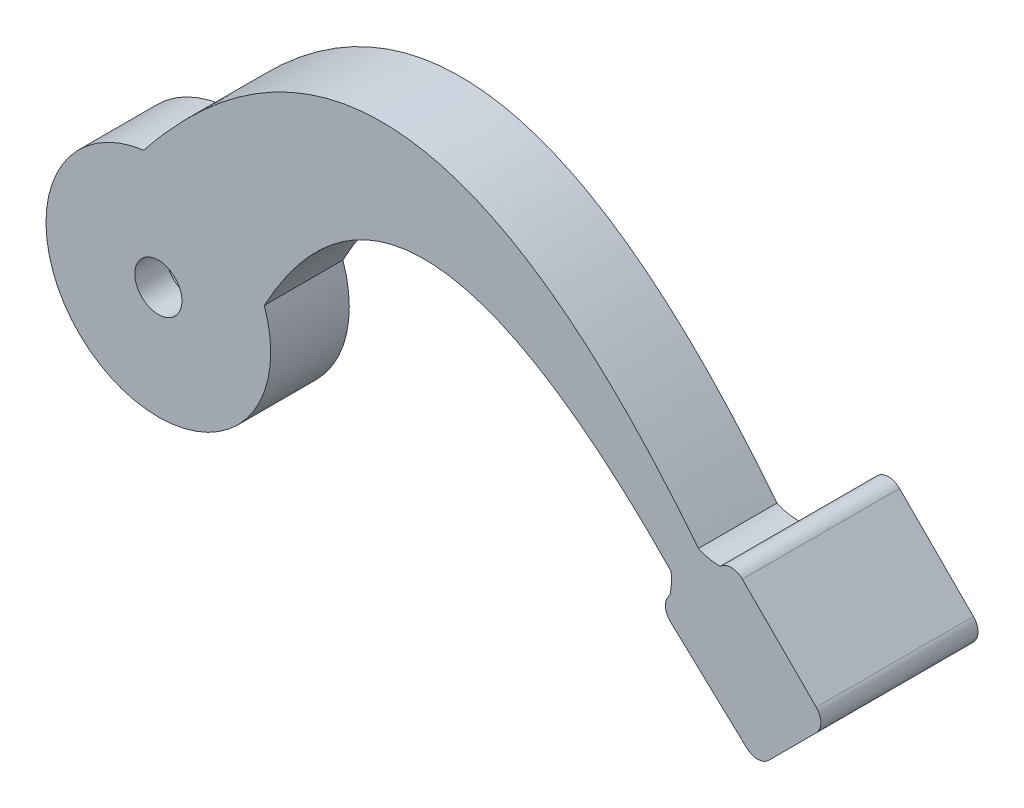
ISO-10303-21;
HEADER;
FILE_DESCRIPTION(('STEP AP214'),'2;1');
FILE_NAME('part.step','',(''),(''),'','','');
FILE_SCHEMA(('AUTOMOTIVE_DESIGN { 1 0 10303 214 1 1 1 1 }'));
ENDSEC;
DATA;
#1=APPLICATION_CONTEXT('core data for automotive mechanical design processes');
#2=APPLICATION_PROTOCOL_DEFINITION('international standard','automotive_design',2000,#1);
#3=PRODUCT_CONTEXT('',#1,'mechanical');
#4=PRODUCT('Part','Part','',(#3));
#5=PRODUCT_RELATED_PRODUCT_CATEGORY('part','',(#4));
#6=PRODUCT_DEFINITION_FORMATION('','',#4);
#7=PRODUCT_DEFINITION_CONTEXT('part definition',#1,'design');
#8=PRODUCT_DEFINITION('design','',#6,#7);
#9=PRODUCT_DEFINITION_SHAPE('','',#8);
#10=(LENGTH_UNIT() NAMED_UNIT(*) SI_UNIT(.MILLI.,.METRE.));
#11=(NAMED_UNIT(*) PLANE_ANGLE_UNIT() SI_UNIT($,.RADIAN.));
#12=(NAMED_UNIT(*) SI_UNIT($,.STERADIAN.) SOLID_ANGLE_UNIT());
#13=UNCERTAINTY_MEASURE_WITH_UNIT(LENGTH_MEASURE(1.E-05),#10,'distance_accuracy_value','');
#14=(GEOMETRIC_REPRESENTATION_CONTEXT(3) GLOBAL_UNCERTAINTY_ASSIGNED_CONTEXT((#13)) GLOBAL_UNIT_ASSIGNED_CONTEXT((#10,
#11,#12)) REPRESENTATION_CONTEXT('',''));
#15=CARTESIAN_POINT('',(0.,0.,0.));
#16=DIRECTION('',(0.,0.,1.));
#17=DIRECTION('',(1.,0.,0.));
#18=AXIS2_PLACEMENT_3D('',#15,#16,#17);
#19=CARTESIAN_POINT('',(0.,0.,5.));
#20=DIRECTION('',(0.,0.,-1.));
#21=DIRECTION('',(-1.,0.,0.));
#22=AXIS2_PLACEMENT_3D('',#19,#20,#21);
#23=CYLINDRICAL_SURFACE('',#22,3.15);
#24=CARTESIAN_POINT('',(0.,0.,0.));
#25=DIRECTION('',(0.,0.,1.));
#26=DIRECTION('',(1.,0.,0.));
#27=AXIS2_PLACEMENT_3D('',#24,#25,#26);
#28=CIRCLE('',#27,3.15);
#29=CARTESIAN_POINT('',(3.15,0.,0.));
#30=VERTEX_POINT('',#29);
#31=EDGE_CURVE('E230',#30,#30,#28,.T.);
#32=ORIENTED_EDGE('',*,*,#31,.F.);
#33=EDGE_LOOP('',(#32));
#34=FACE_BOUND('',#33,.T.);
#35=CARTESIAN_POINT('',(0.,0.,3.));
#36=DIRECTION('',(0.,0.,1.));
#37=DIRECTION('',(1.,0.,0.));
#38=AXIS2_PLACEMENT_3D('',#35,#36,#37);
#39=CIRCLE('',#38,3.15);
#40=CARTESIAN_POINT('',(3.15,0.,3.));
#41=VERTEX_POINT('',#40);
#42=EDGE_CURVE('E182',#41,#41,#39,.T.);
#43=ORIENTED_EDGE('',*,*,#42,.T.);
#44=EDGE_LOOP('',(#43));
#45=FACE_BOUND('',#44,.T.);
#46=ADVANCED_FACE('F39',(#34,#45),#23,.F.);
#47=CARTESIAN_POINT('',(0.,0.,5.));
#48=DIRECTION('',(0.,0.,1.));
#49=DIRECTION('',(1.,0.,0.));
#50=AXIS2_PLACEMENT_3D('',#47,#48,#49);
#51=PLANE('',#50);
#52=CARTESIAN_POINT('',(6.74388026215485,2.37541133484671,5.));
#53=CARTESIAN_POINT('',(15.7783251117649,19.1170818564112,5.));
#54=CARTESIAN_POINT('',(34.0210549557124,-0.824268448298984,5.));
#55=B_SPLINE_CURVE_WITH_KNOTS('',2,(#52,#53,#54),.UNSPECIFIED.,.F.,.F.,(3,3),(0.,1.),.UNSPECIFIED.);
#56=CARTESIAN_POINT('',(6.74388026215485,2.37541133484671,5.));
#57=VERTEX_POINT('',#56);
#58=CARTESIAN_POINT('',(32.6321249510876,0.654655176174024,5.));
#59=VERTEX_POINT('',#58);
#60=EDGE_CURVE('E72',#57,#59,#55,.T.);
#61=ORIENTED_EDGE('',*,*,#60,.T.);
#62=CARTESIAN_POINT('',(31.368103592602,3.24060207044614,5.));
#63=CARTESIAN_POINT('',(33.0113490805245,1.48328105636034,5.));
#64=CARTESIAN_POINT('',(32.5550480902505,-0.697118827142548,5.));
#65=B_SPLINE_CURVE_WITH_KNOTS('',2,(#62,#63,#64),.UNSPECIFIED.,.F.,.F.,(3,3),(0.,1.),.UNSPECIFIED.);
#66=CARTESIAN_POINT('',(32.5550480902505,-0.697118827142546,5.));
#67=VERTEX_POINT('',#66);
#68=EDGE_CURVE('E79',#59,#67,#65,.T.);
#69=ORIENTED_EDGE('',*,*,#68,.T.);
#70=CARTESIAN_POINT('',(33.262154871437,-1.4042256083291,5.));
#71=DIRECTION('',(0.,0.,1.));
#72=DIRECTION('',(1.,0.,0.));
#73=AXIS2_PLACEMENT_3D('',#70,#71,#72);
#74=CIRCLE('',#73,0.999999999999999);
#75=CARTESIAN_POINT('',(32.5805308110778,-2.13592817108212,5.));
#76=VERTEX_POINT('',#75);
#77=EDGE_CURVE('E171',#67,#76,#74,.T.);
#78=ORIENTED_EDGE('',*,*,#77,.T.);
#79=DIRECTION('',(0.731702562753024,-0.681624060359269,0.));
#80=VECTOR('',#79,1.);
#81=CARTESIAN_POINT('',(37.4487491910125,-6.67096050219999,5.));
#82=LINE('',#81,#80);
#83=CARTESIAN_POINT('',(37.4487491910125,-6.6709605022,5.));
#84=VERTEX_POINT('',#83);
#85=EDGE_CURVE('E251',#76,#84,#82,.T.);
#86=ORIENTED_EDGE('',*,*,#85,.T.);
#87=CARTESIAN_POINT('',(38.1303732513718,-5.93925793944698,5.));
#88=DIRECTION('',(0.,0.,1.));
#89=DIRECTION('',(-1.,0.,0.));
#90=AXIS2_PLACEMENT_3D('',#87,#88,#89);
#91=CIRCLE('',#90,0.999999999999995);
#92=CARTESIAN_POINT('',(38.8374800325584,-6.64636472063352,5.));
#93=VERTEX_POINT('',#92);
#94=EDGE_CURVE('E263',#84,#93,#91,.T.);
#95=ORIENTED_EDGE('',*,*,#94,.T.);
#96=DIRECTION('',(0.707106781186548,0.707106781186547,0.));
#97=VECTOR('',#96,1.);
#98=CARTESIAN_POINT('',(41.8637915183506,-3.62005323484132,5.));
#99=LINE('',#98,#97);
#100=CARTESIAN_POINT('',(41.8637915183506,-3.62005323484132,5.));
#101=VERTEX_POINT('',#100);
#102=EDGE_CURVE('E266',#93,#101,#99,.T.);
#103=ORIENTED_EDGE('',*,*,#102,.T.);
#104=CARTESIAN_POINT('',(41.156684737164,-2.91294645365477,5.));
#105=DIRECTION('',(0.,0.,1.));
#106=DIRECTION('',(-1.,0.,0.));
#107=AXIS2_PLACEMENT_3D('',#104,#105,#106);
#108=CIRCLE('',#107,0.999999999999996);
#109=CARTESIAN_POINT('',(41.8637915183506,-2.20583967246823,5.));
#110=VERTEX_POINT('',#109);
#111=EDGE_CURVE('E269',#101,#110,#108,.T.);
#112=ORIENTED_EDGE('',*,*,#111,.T.);
#113=DIRECTION('',(-0.707106781186547,0.707106781186548,0.));
#114=VECTOR('',#113,1.);
#115=CARTESIAN_POINT('',(37.1621661628242,2.4957856830581,5.));
#116=LINE('',#115,#114);
#117=CARTESIAN_POINT('',(37.1621661628242,2.4957856830581,5.));
#118=VERTEX_POINT('',#117);
#119=EDGE_CURVE('E272',#110,#118,#116,.T.);
#120=ORIENTED_EDGE('',*,*,#119,.T.);
#121=CARTESIAN_POINT('',(36.4550593816377,1.78867890187155,5.));
#122=DIRECTION('',(0.,0.,1.));
#123=DIRECTION('',(-1.,0.,0.));
#124=AXIS2_PLACEMENT_3D('',#121,#122,#123);
#125=CIRCLE('',#124,1.);
#126=CARTESIAN_POINT('',(35.7479526004511,2.4957856830581,5.));
#127=VERTEX_POINT('',#126);
#128=EDGE_CURVE('E275',#118,#127,#125,.T.);
#129=ORIENTED_EDGE('',*,*,#128,.T.);
#130=CARTESIAN_POINT('',(35.7479526004511,2.4957856830581,5.));
#131=CARTESIAN_POINT('',(33.9748506145299,2.52505140535702,5.));
#132=CARTESIAN_POINT('',(32.9213950101655,4.01724777922791,5.));
#133=B_SPLINE_CURVE_WITH_KNOTS('',2,(#130,#131,#132),.UNSPECIFIED.,.F.,.F.,(3,3),(0.,1.),.UNSPECIFIED.);
#134=CARTESIAN_POINT('',(34.3623263576712,2.78867889547021,5.));
#135=VERTEX_POINT('',#134);
#136=EDGE_CURVE('E249',#127,#135,#133,.T.);
#137=ORIENTED_EDGE('',*,*,#136,.T.);
#138=CARTESIAN_POINT('',(35.9052240240487,0.760247248579325,5.));
#139=CARTESIAN_POINT('',(15.7376384267378,28.1143705487312,5.));
#140=CARTESIAN_POINT('',(-0.926838299045893,7.08967353038359,5.));
#141=B_SPLINE_CURVE_WITH_KNOTS('',2,(#138,#139,#140),.UNSPECIFIED.,.F.,.F.,(3,3),(0.,1.),.UNSPECIFIED.);
#142=CARTESIAN_POINT('',(-0.926838299045891,7.08967353038359,5.));
#143=VERTEX_POINT('',#142);
#144=EDGE_CURVE('E54',#135,#143,#141,.T.);
#145=ORIENTED_EDGE('',*,*,#144,.T.);
#146=CARTESIAN_POINT('',(0.,0.,5.));
#147=DIRECTION('',(0.,0.,1.));
#148=DIRECTION('',(1.,0.,0.));
#149=AXIS2_PLACEMENT_3D('',#146,#147,#148);
#150=CIRCLE('',#149,7.15);
#151=EDGE_CURVE('E225',#143,#57,#150,.T.);
#152=ORIENTED_EDGE('',*,*,#151,.T.);
#153=EDGE_LOOP('',(#61,#69,#78,#86,#95,#103,#112,#120,#129,#137,#145,#152));
#154=FACE_BOUND('',#153,.T.);
#155=CARTESIAN_POINT('',(0.,0.,5.));
#156=DIRECTION('',(0.,0.,1.));
#157=DIRECTION('',(1.,0.,0.));
#158=AXIS2_PLACEMENT_3D('',#155,#156,#157);
#159=CIRCLE('',#158,1.5);
#160=CARTESIAN_POINT('',(1.5,0.,5.));
#161=VERTEX_POINT('',#160);
#162=EDGE_CURVE('E183',#161,#161,#159,.T.);
#163=ORIENTED_EDGE('',*,*,#162,.F.);
#164=EDGE_LOOP('',(#163));
#165=FACE_BOUND('',#164,.T.);
#166=ADVANCED_FACE('F212',(#154,#165),#51,.T.);
#167=CARTESIAN_POINT('',(0.,0.,0.));
#168=DIRECTION('',(0.,0.,1.));
#169=DIRECTION('',(1.,0.,0.));
#170=AXIS2_PLACEMENT_3D('',#167,#168,#169);
#171=PLANE('',#170);
#172=CARTESIAN_POINT('',(0.,0.,0.));
#173=DIRECTION('',(0.,0.,1.));
#174=DIRECTION('',(1.,0.,0.));
#175=AXIS2_PLACEMENT_3D('',#172,#173,#174);
#176=CIRCLE('',#175,7.15);
#177=CARTESIAN_POINT('',(-0.926838299045893,7.08967353038359,0.));
#178=VERTEX_POINT('',#177);
#179=CARTESIAN_POINT('',(6.74388026215485,2.37541133484671,0.));
#180=VERTEX_POINT('',#179);
#181=EDGE_CURVE('E228',#178,#180,#176,.T.);
#182=ORIENTED_EDGE('',*,*,#181,.F.);
#183=CARTESIAN_POINT('',(35.9052240240487,0.760247248579325,0.));
#184=CARTESIAN_POINT('',(15.7376384267378,28.1143705487312,0.));
#185=CARTESIAN_POINT('',(-0.926838299045893,7.08967353038359,0.));
#186=B_SPLINE_CURVE_WITH_KNOTS('',2,(#183,#184,#185),.UNSPECIFIED.,.F.,.F.,(3,3),(0.,1.),.UNSPECIFIED.);
#187=CARTESIAN_POINT('',(34.362326343591,2.78867890176701,0.));
#188=VERTEX_POINT('',#187);
#189=EDGE_CURVE('E189',#188,#178,#186,.T.);
#190=ORIENTED_EDGE('',*,*,#189,.F.);
#191=CARTESIAN_POINT('',(35.7479526004511,2.4957856830581,0.));
#192=CARTESIAN_POINT('',(33.9748506145299,2.52505140535702,0.));
#193=CARTESIAN_POINT('',(32.9213950101655,4.01724777922791,0.));
#194=B_SPLINE_CURVE_WITH_KNOTS('',2,(#191,#192,#193),.UNSPECIFIED.,.F.,.F.,(3,3),(0.,1.),.UNSPECIFIED.);
#195=CARTESIAN_POINT('',(35.7479526004511,2.4957856830581,0.));
#196=VERTEX_POINT('',#195);
#197=EDGE_CURVE('E164',#188,#196,#194,.F.);
#198=ORIENTED_EDGE('',*,*,#197,.T.);
#199=DIRECTION('',(-0.707106781186547,-0.707106781186548,0.));
#200=VECTOR('',#199,1.);
#201=CARTESIAN_POINT('',(35.7479526004511,2.4957856830581,0.));
#202=LINE('',#201,#200);
#203=CARTESIAN_POINT('',(32.5550480902505,-0.697118827142546,0.));
#204=VERTEX_POINT('',#203);
#205=EDGE_CURVE('E145',#196,#204,#202,.T.);
#206=ORIENTED_EDGE('',*,*,#205,.T.);
#207=CARTESIAN_POINT('',(31.368103592602,3.24060207044614,0.));
#208=CARTESIAN_POINT('',(33.0113490805245,1.48328105636034,0.));
#209=CARTESIAN_POINT('',(32.5550480902505,-0.697118827142548,0.));
#210=B_SPLINE_CURVE_WITH_KNOTS('',2,(#207,#208,#209),.UNSPECIFIED.,.F.,.F.,(3,3),(0.,1.),.UNSPECIFIED.);
#211=CARTESIAN_POINT('',(32.6321249510929,0.654655176123201,0.));
#212=VERTEX_POINT('',#211);
#213=EDGE_CURVE('E162',#204,#212,#210,.F.);
#214=ORIENTED_EDGE('',*,*,#213,.T.);
#215=CARTESIAN_POINT('',(6.74388026215485,2.37541133484671,0.));
#216=CARTESIAN_POINT('',(15.7783251117649,19.1170818564112,0.));
#217=CARTESIAN_POINT('',(34.0210549557124,-0.824268448298984,0.));
#218=B_SPLINE_CURVE_WITH_KNOTS('',2,(#215,#216,#217),.UNSPECIFIED.,.F.,.F.,(3,3),(0.,1.),.UNSPECIFIED.);
#219=EDGE_CURVE('E194',#180,#212,#218,.T.);
#220=ORIENTED_EDGE('',*,*,#219,.F.);
#221=EDGE_LOOP('',(#182,#190,#198,#206,#214,#220));
#222=FACE_BOUND('',#221,.T.);
#223=ORIENTED_EDGE('',*,*,#31,.T.);
#224=EDGE_LOOP('',(#223));
#225=FACE_BOUND('',#224,.T.);
#226=ADVANCED_FACE('F160',(#222,#225),#171,.F.);
#227=CARTESIAN_POINT('',(0.,0.,5.));
#228=DIRECTION('',(0.,0.,-1.));
#229=DIRECTION('',(-1.,0.,0.));
#230=AXIS2_PLACEMENT_3D('',#227,#228,#229);
#231=CYLINDRICAL_SURFACE('',#230,7.15);
#232=ORIENTED_EDGE('',*,*,#151,.F.);
#233=DIRECTION('',(0.,0.,1.));
#234=VECTOR('',#233,1.);
#235=CARTESIAN_POINT('',(-0.926838299045893,7.08967353038359,0.));
#236=LINE('',#235,#234);
#237=EDGE_CURVE('E227',#178,#143,#236,.T.);
#238=ORIENTED_EDGE('',*,*,#237,.F.);
#239=ORIENTED_EDGE('',*,*,#181,.T.);
#240=DIRECTION('',(0.,0.,1.));
#241=VECTOR('',#240,1.);
#242=CARTESIAN_POINT('',(6.74388026215485,2.37541133484671,0.));
#243=LINE('',#242,#241);
#244=EDGE_CURVE('E63',#180,#57,#243,.T.);
#245=ORIENTED_EDGE('',*,*,#244,.T.);
#246=EDGE_LOOP('',(#232,#238,#239,#245));
#247=FACE_BOUND('',#246,.T.);
#248=ADVANCED_FACE('F41',(#247),#231,.T.);
#249=DIRECTION('',(0.,0.,1.));
#250=VECTOR('',#249,1.);
#251=SURFACE_OF_LINEAR_EXTRUSION('',#186,#250);
#252=DIRECTION('',(0.,0.,1.));
#253=VECTOR('',#252,1.);
#254=CARTESIAN_POINT('',(34.362326343591,2.78867890176701,-5.));
#255=LINE('',#254,#253);
#256=EDGE_CURVE('E11',#188,#135,#255,.T.);
#257=ORIENTED_EDGE('',*,*,#256,.F.);
#258=ORIENTED_EDGE('',*,*,#189,.T.);
#259=ORIENTED_EDGE('',*,*,#237,.T.);
#260=ORIENTED_EDGE('',*,*,#144,.F.);
#261=EDGE_LOOP('',(#257,#258,#259,#260));
#262=FACE_BOUND('',#261,.T.);
#263=ADVANCED_FACE('F203',(#262),#251,.T.);
#264=DIRECTION('',(0.,0.,1.));
#265=VECTOR('',#264,1.);
#266=SURFACE_OF_LINEAR_EXTRUSION('',#218,#265);
#267=DIRECTION('',(0.,0.,1.));
#268=VECTOR('',#267,1.);
#269=CARTESIAN_POINT('',(32.6321249510929,0.65465517612328,-5.));
#270=LINE('',#269,#268);
#271=EDGE_CURVE('E47',#59,#212,#270,.F.);
#272=ORIENTED_EDGE('',*,*,#271,.F.);
#273=ORIENTED_EDGE('',*,*,#60,.F.);
#274=ORIENTED_EDGE('',*,*,#244,.F.);
#275=ORIENTED_EDGE('',*,*,#219,.T.);
#276=EDGE_LOOP('',(#272,#273,#274,#275));
#277=FACE_BOUND('',#276,.T.);
#278=ADVANCED_FACE('F207',(#277),#266,.T.);
#279=CARTESIAN_POINT('',(0.,0.,3.));
#280=DIRECTION('',(0.,0.,1.));
#281=DIRECTION('',(1.,0.,0.));
#282=AXIS2_PLACEMENT_3D('',#279,#280,#281);
#283=PLANE('',#282);
#284=CARTESIAN_POINT('',(0.,0.,3.));
#285=DIRECTION('',(0.,0.,1.));
#286=DIRECTION('',(1.,0.,0.));
#287=AXIS2_PLACEMENT_3D('',#284,#285,#286);
#288=CIRCLE('',#287,1.5);
#289=CARTESIAN_POINT('',(1.5,0.,3.));
#290=VERTEX_POINT('',#289);
#291=EDGE_CURVE('E179',#290,#290,#288,.T.);
#292=ORIENTED_EDGE('',*,*,#291,.T.);
#293=EDGE_LOOP('',(#292));
#294=FACE_BOUND('',#293,.T.);
#295=ORIENTED_EDGE('',*,*,#42,.F.);
#296=EDGE_LOOP('',(#295));
#297=FACE_BOUND('',#296,.T.);
#298=ADVANCED_FACE('F323',(#294,#297),#283,.F.);
#299=CARTESIAN_POINT('',(0.,0.,3.));
#300=DIRECTION('',(0.,0.,1.));
#301=DIRECTION('',(1.,0.,0.));
#302=AXIS2_PLACEMENT_3D('',#299,#300,#301);
#303=CYLINDRICAL_SURFACE('',#302,1.5);
#304=ORIENTED_EDGE('',*,*,#291,.F.);
#305=EDGE_LOOP('',(#304));
#306=FACE_BOUND('',#305,.T.);
#307=ORIENTED_EDGE('',*,*,#162,.T.);
#308=EDGE_LOOP('',(#307));
#309=FACE_BOUND('',#308,.T.);
#310=ADVANCED_FACE('F328',(#306,#309),#303,.F.);
#311=CARTESIAN_POINT('',(35.7479526004511,2.4957856830581,-5.));
#312=CARTESIAN_POINT('',(33.9748506145299,2.52505140535702,-5.));
#313=CARTESIAN_POINT('',(32.9213950101655,4.01724777922791,-5.));
#314=B_SPLINE_CURVE_WITH_KNOTS('',2,(#311,#312,#313),.UNSPECIFIED.,.F.,.F.,(3,3),(0.,1.),.UNSPECIFIED.);
#315=DIRECTION('',(0.,0.,1.));
#316=VECTOR('',#315,1.);
#317=SURFACE_OF_LINEAR_EXTRUSION('',#314,#316);
#318=ORIENTED_EDGE('',*,*,#197,.F.);
#319=ORIENTED_EDGE('',*,*,#256,.T.);
#320=ORIENTED_EDGE('',*,*,#136,.F.);
#321=DIRECTION('',(0.,0.,1.));
#322=VECTOR('',#321,1.);
#323=CARTESIAN_POINT('',(35.7479526004511,2.4957856830581,-5.));
#324=LINE('',#323,#322);
#325=EDGE_CURVE('E281',#196,#127,#324,.T.);
#326=ORIENTED_EDGE('',*,*,#325,.F.);
#327=EDGE_LOOP('',(#318,#319,#320,#326));
#328=FACE_BOUND('',#327,.T.);
#329=ADVANCED_FACE('F320',(#328),#317,.T.);
#330=CARTESIAN_POINT('',(31.368103592602,3.24060207044614,-5.));
#331=CARTESIAN_POINT('',(33.0113490805245,1.48328105636034,-5.));
#332=CARTESIAN_POINT('',(32.5550480902505,-0.697118827142548,-5.));
#333=B_SPLINE_CURVE_WITH_KNOTS('',2,(#330,#331,#332),.UNSPECIFIED.,.F.,.F.,(3,3),(0.,1.),.UNSPECIFIED.);
#334=DIRECTION('',(0.,0.,1.));
#335=VECTOR('',#334,1.);
#336=SURFACE_OF_LINEAR_EXTRUSION('',#333,#335);
#337=ORIENTED_EDGE('',*,*,#213,.F.);
#338=DIRECTION('',(0.,0.,1.));
#339=VECTOR('',#338,1.);
#340=CARTESIAN_POINT('',(32.5550480902505,-0.697118827142546,-5.));
#341=LINE('',#340,#339);
#342=EDGE_CURVE('E154',#204,#67,#341,.T.);
#343=ORIENTED_EDGE('',*,*,#342,.T.);
#344=ORIENTED_EDGE('',*,*,#68,.F.);
#345=ORIENTED_EDGE('',*,*,#271,.T.);
#346=EDGE_LOOP('',(#337,#343,#344,#345));
#347=FACE_BOUND('',#346,.T.);
#348=ADVANCED_FACE('F166',(#347),#336,.T.);
#349=CARTESIAN_POINT('',(36.4550593816377,1.78867890187155,-5.));
#350=DIRECTION('',(0.,0.,1.));
#351=DIRECTION('',(1.,0.,0.));
#352=AXIS2_PLACEMENT_3D('',#349,#350,#351);
#353=CYLINDRICAL_SURFACE('',#352,1.);
#354=ORIENTED_EDGE('',*,*,#128,.F.);
#355=DIRECTION('',(0.,0.,1.));
#356=VECTOR('',#355,1.);
#357=CARTESIAN_POINT('',(37.1621661628242,2.4957856830581,-5.));
#358=LINE('',#357,#356);
#359=CARTESIAN_POINT('',(37.1621661628242,2.4957856830581,-5.));
#360=VERTEX_POINT('',#359);
#361=EDGE_CURVE('E282',#360,#118,#358,.T.);
#362=ORIENTED_EDGE('',*,*,#361,.F.);
#363=CARTESIAN_POINT('',(36.4550593816377,1.78867890187155,-5.));
#364=DIRECTION('',(0.,0.,1.));
#365=DIRECTION('',(-1.,0.,0.));
#366=AXIS2_PLACEMENT_3D('',#363,#364,#365);
#367=CIRCLE('',#366,1.);
#368=CARTESIAN_POINT('',(35.7479526004511,2.4957856830581,-5.));
#369=VERTEX_POINT('',#368);
#370=EDGE_CURVE('E172',#360,#369,#367,.T.);
#371=ORIENTED_EDGE('',*,*,#370,.T.);
#372=EDGE_CURVE('E186',#369,#196,#324,.T.);
#373=ORIENTED_EDGE('',*,*,#372,.T.);
#374=ORIENTED_EDGE('',*,*,#325,.T.);
#375=EDGE_LOOP('',(#354,#362,#371,#373,#374));
#376=FACE_BOUND('',#375,.T.);
#377=ADVANCED_FACE('F316',(#376),#353,.T.);
#378=CARTESIAN_POINT('',(37.1621661628242,2.4957856830581,-5.));
#379=DIRECTION('',(0.707106781186548,0.707106781186547,0.));
#380=DIRECTION('',(-0.707106781186547,0.707106781186548,0.));
#381=AXIS2_PLACEMENT_3D('',#378,#379,#380);
#382=PLANE('',#381);
#383=ORIENTED_EDGE('',*,*,#119,.F.);
#384=DIRECTION('',(0.,0.,1.));
#385=VECTOR('',#384,1.);
#386=CARTESIAN_POINT('',(41.8637915183506,-2.20583967246823,-5.));
#387=LINE('',#386,#385);
#388=CARTESIAN_POINT('',(41.8637915183506,-2.20583967246823,-5.));
#389=VERTEX_POINT('',#388);
#390=EDGE_CURVE('E284',#389,#110,#387,.T.);
#391=ORIENTED_EDGE('',*,*,#390,.F.);
#392=DIRECTION('',(-0.707106781186547,0.707106781186548,0.));
#393=VECTOR('',#392,1.);
#394=CARTESIAN_POINT('',(37.1621661628242,2.4957856830581,-5.));
#395=LINE('',#394,#393);
#396=EDGE_CURVE('E174',#389,#360,#395,.T.);
#397=ORIENTED_EDGE('',*,*,#396,.T.);
#398=ORIENTED_EDGE('',*,*,#361,.T.);
#399=EDGE_LOOP('',(#383,#391,#397,#398));
#400=FACE_BOUND('',#399,.T.);
#401=ADVANCED_FACE('F366',(#400),#382,.T.);
#402=CARTESIAN_POINT('',(41.156684737164,-2.91294645365477,-5.));
#403=DIRECTION('',(0.,0.,1.));
#404=DIRECTION('',(1.,0.,0.));
#405=AXIS2_PLACEMENT_3D('',#402,#403,#404);
#406=CYLINDRICAL_SURFACE('',#405,0.999999999999996);
#407=ORIENTED_EDGE('',*,*,#111,.F.);
#408=DIRECTION('',(0.,0.,1.));
#409=VECTOR('',#408,1.);
#410=CARTESIAN_POINT('',(41.8637915183506,-3.62005323484132,-5.));
#411=LINE('',#410,#409);
#412=CARTESIAN_POINT('',(41.8637915183506,-3.62005323484132,-5.));
#413=VERTEX_POINT('',#412);
#414=EDGE_CURVE('E286',#413,#101,#411,.T.);
#415=ORIENTED_EDGE('',*,*,#414,.F.);
#416=CARTESIAN_POINT('',(41.156684737164,-2.91294645365477,-5.));
#417=DIRECTION('',(0.,0.,1.));
#418=DIRECTION('',(-1.,0.,0.));
#419=AXIS2_PLACEMENT_3D('',#416,#417,#418);
#420=CIRCLE('',#419,0.999999999999996);
#421=EDGE_CURVE('E362',#413,#389,#420,.T.);
#422=ORIENTED_EDGE('',*,*,#421,.T.);
#423=ORIENTED_EDGE('',*,*,#390,.T.);
#424=EDGE_LOOP('',(#407,#415,#422,#423));
#425=FACE_BOUND('',#424,.T.);
#426=ADVANCED_FACE('F311',(#425),#406,.T.);
#427=CARTESIAN_POINT('',(41.8637915183506,-3.62005323484132,-5.));
#428=DIRECTION('',(0.707106781186547,-0.707106781186548,0.));
#429=DIRECTION('',(0.707106781186548,0.707106781186547,0.));
#430=AXIS2_PLACEMENT_3D('',#427,#428,#429);
#431=PLANE('',#430);
#432=ORIENTED_EDGE('',*,*,#102,.F.);
#433=DIRECTION('',(0.,0.,1.));
#434=VECTOR('',#433,1.);
#435=CARTESIAN_POINT('',(38.8374800325584,-6.64636472063352,-5.));
#436=LINE('',#435,#434);
#437=CARTESIAN_POINT('',(38.8374800325584,-6.64636472063352,-5.));
#438=VERTEX_POINT('',#437);
#439=EDGE_CURVE('E288',#438,#93,#436,.T.);
#440=ORIENTED_EDGE('',*,*,#439,.F.);
#441=DIRECTION('',(0.707106781186548,0.707106781186547,0.));
#442=VECTOR('',#441,1.);
#443=CARTESIAN_POINT('',(41.8637915183506,-3.62005323484132,-5.));
#444=LINE('',#443,#442);
#445=EDGE_CURVE('E307',#438,#413,#444,.T.);
#446=ORIENTED_EDGE('',*,*,#445,.T.);
#447=ORIENTED_EDGE('',*,*,#414,.T.);
#448=EDGE_LOOP('',(#432,#440,#446,#447));
#449=FACE_BOUND('',#448,.T.);
#450=ADVANCED_FACE('F305',(#449),#431,.T.);
#451=CARTESIAN_POINT('',(38.1303732513718,-5.93925793944698,-5.));
#452=DIRECTION('',(0.,0.,1.));
#453=DIRECTION('',(1.,0.,0.));
#454=AXIS2_PLACEMENT_3D('',#451,#452,#453);
#455=CYLINDRICAL_SURFACE('',#454,0.999999999999995);
#456=ORIENTED_EDGE('',*,*,#94,.F.);
#457=DIRECTION('',(0.,0.,1.));
#458=VECTOR('',#457,1.);
#459=CARTESIAN_POINT('',(37.4487491910125,-6.6709605022,-5.));
#460=LINE('',#459,#458);
#461=CARTESIAN_POINT('',(37.4487491910125,-6.6709605022,-5.));
#462=VERTEX_POINT('',#461);
#463=EDGE_CURVE('E289',#462,#84,#460,.T.);
#464=ORIENTED_EDGE('',*,*,#463,.F.);
#465=CARTESIAN_POINT('',(38.1303732513718,-5.93925793944698,-5.));
#466=DIRECTION('',(0.,0.,1.));
#467=DIRECTION('',(-1.,0.,0.));
#468=AXIS2_PLACEMENT_3D('',#465,#466,#467);
#469=CIRCLE('',#468,0.999999999999995);
#470=EDGE_CURVE('E301',#462,#438,#469,.T.);
#471=ORIENTED_EDGE('',*,*,#470,.T.);
#472=ORIENTED_EDGE('',*,*,#439,.T.);
#473=EDGE_LOOP('',(#456,#464,#471,#472));
#474=FACE_BOUND('',#473,.T.);
#475=ADVANCED_FACE('F298',(#474),#455,.T.);
#476=CARTESIAN_POINT('',(37.4487491910125,-6.67096050219999,-5.));
#477=DIRECTION('',(-0.681624060359269,-0.731702562753024,0.));
#478=DIRECTION('',(0.731702562753024,-0.681624060359269,0.));
#479=AXIS2_PLACEMENT_3D('',#476,#477,#478);
#480=PLANE('',#479);
#481=ORIENTED_EDGE('',*,*,#85,.F.);
#482=DIRECTION('',(0.,0.,1.));
#483=VECTOR('',#482,1.);
#484=CARTESIAN_POINT('',(32.5805308110778,-2.13592817108212,-5.));
#485=LINE('',#484,#483);
#486=CARTESIAN_POINT('',(32.5805308110778,-2.13592817108212,-5.));
#487=VERTEX_POINT('',#486);
#488=EDGE_CURVE('E153',#487,#76,#485,.T.);
#489=ORIENTED_EDGE('',*,*,#488,.F.);
#490=DIRECTION('',(0.731702562753024,-0.681624060359269,0.));
#491=VECTOR('',#490,1.);
#492=CARTESIAN_POINT('',(37.4487491910125,-6.67096050219999,-5.));
#493=LINE('',#492,#491);
#494=EDGE_CURVE('E358',#487,#462,#493,.T.);
#495=ORIENTED_EDGE('',*,*,#494,.T.);
#496=ORIENTED_EDGE('',*,*,#463,.T.);
#497=EDGE_LOOP('',(#481,#489,#495,#496));
#498=FACE_BOUND('',#497,.T.);
#499=ADVANCED_FACE('F295',(#498),#480,.T.);
#500=CARTESIAN_POINT('',(33.262154871437,-1.4042256083291,-5.));
#501=DIRECTION('',(0.,0.,1.));
#502=DIRECTION('',(1.,0.,0.));
#503=AXIS2_PLACEMENT_3D('',#500,#501,#502);
#504=CYLINDRICAL_SURFACE('',#503,0.999999999999999);
#505=ORIENTED_EDGE('',*,*,#77,.F.);
#506=ORIENTED_EDGE('',*,*,#342,.F.);
#507=CARTESIAN_POINT('',(32.5550480902505,-0.697118827142546,-5.));
#508=VERTEX_POINT('',#507);
#509=EDGE_CURVE('E142',#508,#204,#341,.T.);
#510=ORIENTED_EDGE('',*,*,#509,.F.);
#511=CARTESIAN_POINT('',(33.262154871437,-1.4042256083291,-5.));
#512=DIRECTION('',(0.,0.,1.));
#513=DIRECTION('',(1.,0.,0.));
#514=AXIS2_PLACEMENT_3D('',#511,#512,#513);
#515=CIRCLE('',#514,0.999999999999999);
#516=EDGE_CURVE('E278',#508,#487,#515,.T.);
#517=ORIENTED_EDGE('',*,*,#516,.T.);
#518=ORIENTED_EDGE('',*,*,#488,.T.);
#519=EDGE_LOOP('',(#505,#506,#510,#517,#518));
#520=FACE_BOUND('',#519,.T.);
#521=ADVANCED_FACE('F169',(#520),#504,.T.);
#522=CARTESIAN_POINT('',(34.1547622099191,2.89078406825001,-5.));
#523=DIRECTION('',(0.,0.,1.));
#524=DIRECTION('',(1.,0.,0.));
#525=AXIS2_PLACEMENT_3D('',#522,#523,#524);
#526=PLANE('',#525);
#527=ORIENTED_EDGE('',*,*,#516,.F.);
#528=DIRECTION('',(-0.707106781186547,-0.707106781186548,0.));
#529=VECTOR('',#528,1.);
#530=CARTESIAN_POINT('',(35.7479526004511,2.4957856830581,-5.));
#531=LINE('',#530,#529);
#532=EDGE_CURVE('E148',#369,#508,#531,.T.);
#533=ORIENTED_EDGE('',*,*,#532,.F.);
#534=ORIENTED_EDGE('',*,*,#370,.F.);
#535=ORIENTED_EDGE('',*,*,#396,.F.);
#536=ORIENTED_EDGE('',*,*,#421,.F.);
#537=ORIENTED_EDGE('',*,*,#445,.F.);
#538=ORIENTED_EDGE('',*,*,#470,.F.);
#539=ORIENTED_EDGE('',*,*,#494,.F.);
#540=EDGE_LOOP('',(#527,#533,#534,#535,#536,#537,#538,#539));
#541=FACE_BOUND('',#540,.T.);
#542=ADVANCED_FACE('F368',(#541),#526,.F.);
#543=CARTESIAN_POINT('',(35.7479526004511,2.4957856830581,8.78179061716394));
#544=DIRECTION('',(0.707106781186548,-0.707106781186547,0.));
#545=DIRECTION('',(0.707106781186547,0.707106781186548,0.));
#546=AXIS2_PLACEMENT_3D('',#543,#544,#545);
#547=PLANE('',#546);
#548=ORIENTED_EDGE('',*,*,#372,.F.);
#549=ORIENTED_EDGE('',*,*,#532,.T.);
#550=ORIENTED_EDGE('',*,*,#509,.T.);
#551=ORIENTED_EDGE('',*,*,#205,.F.);
#552=EDGE_LOOP('',(#548,#549,#550,#551));
#553=FACE_BOUND('',#552,.T.);
#554=ADVANCED_FACE('F144',(#553),#547,.F.);
#555=CLOSED_SHELL('',(#46,#166,#226,#248,#263,#278,#298,#310,#329,#348,#377,#401,#426,#450,#475,
#499,#521,#542,#554));
#556=MANIFOLD_SOLID_BREP('B2',#555);
#557=ADVANCED_BREP_SHAPE_REPRESENTATION('',(#18,#556),#14);
#558=SHAPE_DEFINITION_REPRESENTATION(#9,#557);
ENDSEC;
END-ISO-10303-21;
